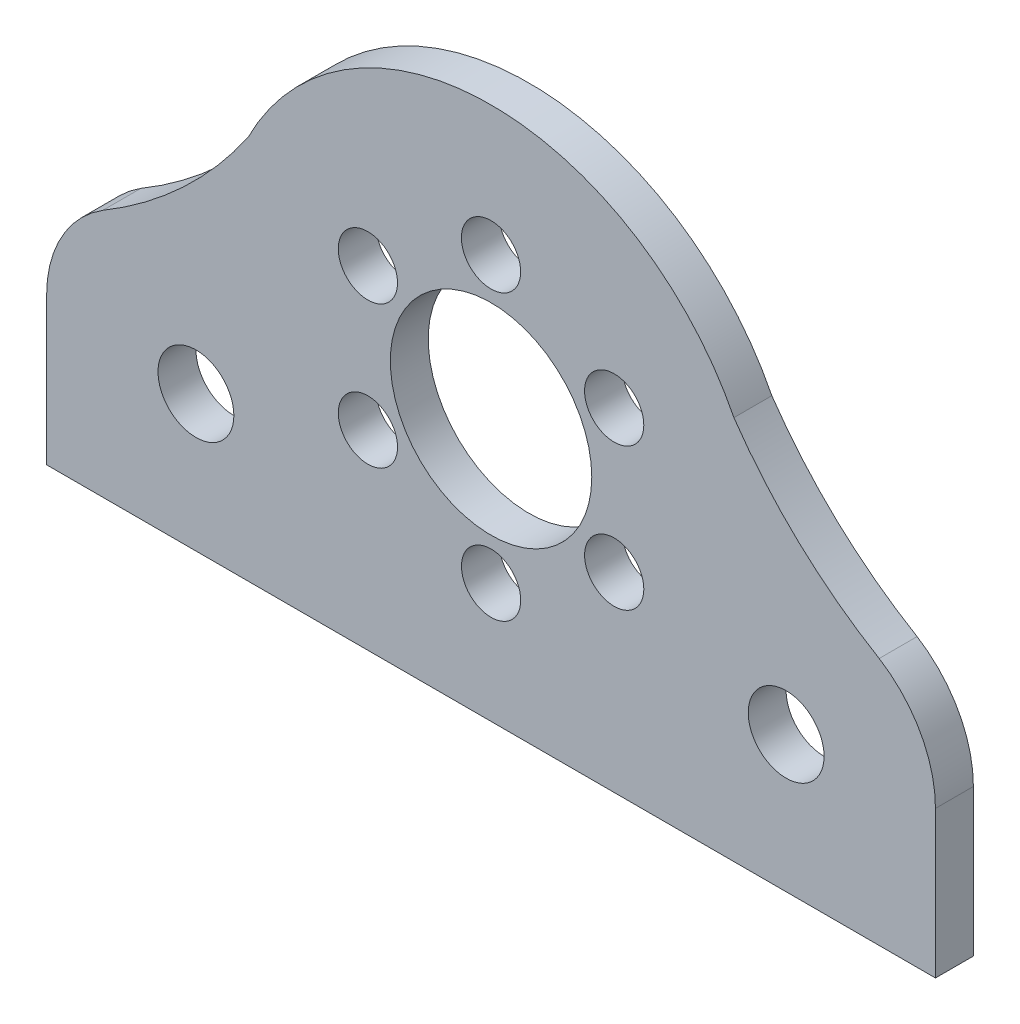
ISO-10303-21;
HEADER;
FILE_DESCRIPTION(('STEP AP214'),'2;1');
FILE_NAME('part.step','',(''),(''),'','','');
FILE_SCHEMA(('AUTOMOTIVE_DESIGN { 1 0 10303 214 1 1 1 1 }'));
ENDSEC;
DATA;
#1=APPLICATION_CONTEXT('core data for automotive mechanical design processes');
#2=APPLICATION_PROTOCOL_DEFINITION('international standard','automotive_design',2000,#1);
#3=PRODUCT_CONTEXT('',#1,'mechanical');
#4=PRODUCT('Part','Part','',(#3));
#5=PRODUCT_RELATED_PRODUCT_CATEGORY('part','',(#4));
#6=PRODUCT_DEFINITION_FORMATION('','',#4);
#7=PRODUCT_DEFINITION_CONTEXT('part definition',#1,'design');
#8=PRODUCT_DEFINITION('design','',#6,#7);
#9=PRODUCT_DEFINITION_SHAPE('','',#8);
#10=(LENGTH_UNIT() NAMED_UNIT(*) SI_UNIT(.MILLI.,.METRE.));
#11=(NAMED_UNIT(*) PLANE_ANGLE_UNIT() SI_UNIT($,.RADIAN.));
#12=(NAMED_UNIT(*) SI_UNIT($,.STERADIAN.) SOLID_ANGLE_UNIT());
#13=UNCERTAINTY_MEASURE_WITH_UNIT(LENGTH_MEASURE(1.E-05),#10,'distance_accuracy_value','');
#14=(GEOMETRIC_REPRESENTATION_CONTEXT(3) GLOBAL_UNCERTAINTY_ASSIGNED_CONTEXT((#13)) GLOBAL_UNIT_ASSIGNED_CONTEXT((#10,
#11,#12)) REPRESENTATION_CONTEXT('',''));
#15=CARTESIAN_POINT('',(0.,0.,0.));
#16=DIRECTION('',(0.,0.,1.));
#17=DIRECTION('',(1.,0.,0.));
#18=AXIS2_PLACEMENT_3D('',#15,#16,#17);
#19=CARTESIAN_POINT('',(18.75,0.,1.6));
#20=DIRECTION('',(-1.,0.,0.));
#21=DIRECTION('',(0.,-1.,0.));
#22=AXIS2_PLACEMENT_3D('',#19,#20,#21);
#23=PLANE('',#22);
#24=DIRECTION('',(0.,1.,0.));
#25=VECTOR('',#24,1.);
#26=CARTESIAN_POINT('',(18.75,0.,0.));
#27=LINE('',#26,#25);
#28=CARTESIAN_POINT('',(18.75,-11.05,0.));
#29=VERTEX_POINT('',#28);
#30=CARTESIAN_POINT('',(18.75,-4.85274711281599,0.));
#31=VERTEX_POINT('',#30);
#32=EDGE_CURVE('E177',#29,#31,#27,.T.);
#33=ORIENTED_EDGE('',*,*,#32,.T.);
#34=DIRECTION('',(0.,0.,-1.));
#35=VECTOR('',#34,1.);
#36=CARTESIAN_POINT('',(18.75,-4.85274711281599,1.6));
#37=LINE('',#36,#35);
#38=CARTESIAN_POINT('',(18.75,-4.85274711281599,1.6));
#39=VERTEX_POINT('',#38);
#40=EDGE_CURVE('E11',#39,#31,#37,.T.);
#41=ORIENTED_EDGE('',*,*,#40,.F.);
#42=DIRECTION('',(0.,1.,0.));
#43=VECTOR('',#42,1.);
#44=CARTESIAN_POINT('',(18.75,0.,1.6));
#45=LINE('',#44,#43);
#46=CARTESIAN_POINT('',(18.75,-11.05,1.6));
#47=VERTEX_POINT('',#46);
#48=EDGE_CURVE('E241',#47,#39,#45,.T.);
#49=ORIENTED_EDGE('',*,*,#48,.F.);
#50=DIRECTION('',(0.,0.,-1.));
#51=VECTOR('',#50,1.);
#52=CARTESIAN_POINT('',(18.75,-11.05,1.6));
#53=LINE('',#52,#51);
#54=EDGE_CURVE('E137',#47,#29,#53,.T.);
#55=ORIENTED_EDGE('',*,*,#54,.T.);
#56=EDGE_LOOP('',(#33,#41,#49,#55));
#57=FACE_BOUND('',#56,.T.);
#58=ADVANCED_FACE('F41',(#57),#23,.F.);
#59=CARTESIAN_POINT('',(13.686827991806,-4.85274711281598,1.6));
#60=DIRECTION('',(0.,0.,-1.));
#61=DIRECTION('',(-1.,0.,0.));
#62=AXIS2_PLACEMENT_3D('',#59,#60,#61);
#63=CYLINDRICAL_SURFACE('',#62,5.06317200819395);
#64=CARTESIAN_POINT('',(13.686827991806,-4.85274711281598,0.));
#65=DIRECTION('',(0.,0.,1.));
#66=DIRECTION('',(1.,0.,0.));
#67=AXIS2_PLACEMENT_3D('',#64,#65,#66);
#68=CIRCLE('',#67,5.06317200819395);
#69=CARTESIAN_POINT('',(16.3755062932759,-0.562441788510514,0.));
#70=VERTEX_POINT('',#69);
#71=EDGE_CURVE('E181',#31,#70,#68,.T.);
#72=ORIENTED_EDGE('',*,*,#71,.T.);
#73=DIRECTION('',(0.,0.,-1.));
#74=VECTOR('',#73,1.);
#75=CARTESIAN_POINT('',(16.3755062932759,-0.562441788510514,1.6));
#76=LINE('',#75,#74);
#77=CARTESIAN_POINT('',(16.3755062932759,-0.562441788510514,1.6));
#78=VERTEX_POINT('',#77);
#79=EDGE_CURVE('E51',#78,#70,#76,.T.);
#80=ORIENTED_EDGE('',*,*,#79,.F.);
#81=CARTESIAN_POINT('',(13.686827991806,-4.85274711281598,1.6));
#82=DIRECTION('',(0.,0.,1.));
#83=DIRECTION('',(1.,0.,0.));
#84=AXIS2_PLACEMENT_3D('',#81,#82,#83);
#85=CIRCLE('',#84,5.06317200819395);
#86=EDGE_CURVE('E98',#39,#78,#85,.T.);
#87=ORIENTED_EDGE('',*,*,#86,.F.);
#88=ORIENTED_EDGE('',*,*,#40,.T.);
#89=EDGE_LOOP('',(#72,#80,#87,#88));
#90=FACE_BOUND('',#89,.T.);
#91=ADVANCED_FACE('F322',(#90),#63,.T.);
#92=CARTESIAN_POINT('',(26.2731058799836,16.1553214426772,1.6));
#93=DIRECTION('',(0.,0.,-1.));
#94=DIRECTION('',(-1.,0.,0.));
#95=AXIS2_PLACEMENT_3D('',#92,#93,#94);
#96=CYLINDRICAL_SURFACE('',#95,19.4279717169047);
#97=CARTESIAN_POINT('',(26.2731058799836,16.1553214426772,0.));
#98=DIRECTION('',(0.,0.,1.));
#99=DIRECTION('',(1.,0.,0.));
#100=AXIS2_PLACEMENT_3D('',#97,#98,#99);
#101=CIRCLE('',#100,19.4279717169047);
#102=CARTESIAN_POINT('',(10.2472642255804,5.17267675658977,0.));
#103=VERTEX_POINT('',#102);
#104=EDGE_CURVE('E184',#70,#103,#101,.F.);
#105=ORIENTED_EDGE('',*,*,#104,.T.);
#106=DIRECTION('',(0.,0.,-1.));
#107=VECTOR('',#106,1.);
#108=CARTESIAN_POINT('',(10.2472642255804,5.17267675658977,1.6));
#109=LINE('',#108,#107);
#110=CARTESIAN_POINT('',(10.2472642255804,5.17267675658977,1.6));
#111=VERTEX_POINT('',#110);
#112=EDGE_CURVE('E212',#111,#103,#109,.T.);
#113=ORIENTED_EDGE('',*,*,#112,.F.);
#114=CARTESIAN_POINT('',(26.2731058799836,16.1553214426772,1.6));
#115=DIRECTION('',(0.,0.,1.));
#116=DIRECTION('',(1.,0.,0.));
#117=AXIS2_PLACEMENT_3D('',#114,#115,#116);
#118=CIRCLE('',#117,19.4279717169047);
#119=EDGE_CURVE('E222',#78,#111,#118,.F.);
#120=ORIENTED_EDGE('',*,*,#119,.F.);
#121=ORIENTED_EDGE('',*,*,#79,.T.);
#122=EDGE_LOOP('',(#105,#113,#120,#121));
#123=FACE_BOUND('',#122,.T.);
#124=ADVANCED_FACE('F220',(#123),#96,.F.);
#125=CARTESIAN_POINT('',(0.,0.,1.6));
#126=DIRECTION('',(0.,0.,-1.));
#127=DIRECTION('',(-1.,0.,0.));
#128=AXIS2_PLACEMENT_3D('',#125,#126,#127);
#129=CYLINDRICAL_SURFACE('',#128,11.4788069474586);
#130=CARTESIAN_POINT('',(0.,0.,0.));
#131=DIRECTION('',(0.,0.,1.));
#132=DIRECTION('',(1.,0.,0.));
#133=AXIS2_PLACEMENT_3D('',#130,#131,#132);
#134=CIRCLE('',#133,11.4788069474586);
#135=CARTESIAN_POINT('',(-10.2472642255804,5.17267675658977,0.));
#136=VERTEX_POINT('',#135);
#137=EDGE_CURVE('E187',#103,#136,#134,.T.);
#138=ORIENTED_EDGE('',*,*,#137,.T.);
#139=DIRECTION('',(0.,0.,-1.));
#140=VECTOR('',#139,1.);
#141=CARTESIAN_POINT('',(-10.2472642255804,5.17267675658977,1.6));
#142=LINE('',#141,#140);
#143=CARTESIAN_POINT('',(-10.2472642255804,5.17267675658977,1.6));
#144=VERTEX_POINT('',#143);
#145=EDGE_CURVE('E209',#144,#136,#142,.T.);
#146=ORIENTED_EDGE('',*,*,#145,.F.);
#147=CARTESIAN_POINT('',(0.,0.,1.6));
#148=DIRECTION('',(0.,0.,1.));
#149=DIRECTION('',(1.,0.,0.));
#150=AXIS2_PLACEMENT_3D('',#147,#148,#149);
#151=CIRCLE('',#150,11.4788069474586);
#152=EDGE_CURVE('E232',#111,#144,#151,.T.);
#153=ORIENTED_EDGE('',*,*,#152,.F.);
#154=ORIENTED_EDGE('',*,*,#112,.T.);
#155=EDGE_LOOP('',(#138,#146,#153,#154));
#156=FACE_BOUND('',#155,.T.);
#157=ADVANCED_FACE('F230',(#156),#129,.T.);
#158=CARTESIAN_POINT('',(-26.2731058799836,16.1553214426772,1.6));
#159=DIRECTION('',(0.,0.,-1.));
#160=DIRECTION('',(-1.,0.,0.));
#161=AXIS2_PLACEMENT_3D('',#158,#159,#160);
#162=CYLINDRICAL_SURFACE('',#161,19.4279717169047);
#163=CARTESIAN_POINT('',(-26.2731058799836,16.1553214426772,0.));
#164=DIRECTION('',(0.,0.,1.));
#165=DIRECTION('',(1.,0.,0.));
#166=AXIS2_PLACEMENT_3D('',#163,#164,#165);
#167=CIRCLE('',#166,19.4279717169047);
#168=CARTESIAN_POINT('',(-16.3755062932759,-0.562441788510506,0.));
#169=VERTEX_POINT('',#168);
#170=EDGE_CURVE('E191',#169,#136,#167,.T.);
#171=ORIENTED_EDGE('',*,*,#170,.F.);
#172=DIRECTION('',(0.,0.,-1.));
#173=VECTOR('',#172,1.);
#174=CARTESIAN_POINT('',(-16.3755062932759,-0.562441788510506,1.6));
#175=LINE('',#174,#173);
#176=CARTESIAN_POINT('',(-16.3755062932759,-0.562441788510506,1.6));
#177=VERTEX_POINT('',#176);
#178=EDGE_CURVE('E124',#177,#169,#175,.T.);
#179=ORIENTED_EDGE('',*,*,#178,.F.);
#180=CARTESIAN_POINT('',(-26.2731058799836,16.1553214426772,1.6));
#181=DIRECTION('',(0.,0.,1.));
#182=DIRECTION('',(1.,0.,0.));
#183=AXIS2_PLACEMENT_3D('',#180,#181,#182);
#184=CIRCLE('',#183,19.4279717169047);
#185=EDGE_CURVE('E130',#177,#144,#184,.T.);
#186=ORIENTED_EDGE('',*,*,#185,.T.);
#187=ORIENTED_EDGE('',*,*,#145,.T.);
#188=EDGE_LOOP('',(#171,#179,#186,#187));
#189=FACE_BOUND('',#188,.T.);
#190=ADVANCED_FACE('F333',(#189),#162,.F.);
#191=CARTESIAN_POINT('',(-13.686827991806,-4.85274711281598,1.6));
#192=DIRECTION('',(0.,0.,-1.));
#193=DIRECTION('',(-1.,0.,0.));
#194=AXIS2_PLACEMENT_3D('',#191,#192,#193);
#195=CYLINDRICAL_SURFACE('',#194,5.06317200819395);
#196=CARTESIAN_POINT('',(-13.686827991806,-4.85274711281598,0.));
#197=DIRECTION('',(0.,0.,1.));
#198=DIRECTION('',(1.,0.,0.));
#199=AXIS2_PLACEMENT_3D('',#196,#197,#198);
#200=CIRCLE('',#199,5.06317200819395);
#201=CARTESIAN_POINT('',(-18.75,-4.85274711281598,0.));
#202=VERTEX_POINT('',#201);
#203=EDGE_CURVE('E118',#202,#169,#200,.F.);
#204=ORIENTED_EDGE('',*,*,#203,.F.);
#205=DIRECTION('',(0.,0.,-1.));
#206=VECTOR('',#205,1.);
#207=CARTESIAN_POINT('',(-18.75,-4.85274711281598,1.6));
#208=LINE('',#207,#206);
#209=CARTESIAN_POINT('',(-18.75,-4.85274711281598,1.6));
#210=VERTEX_POINT('',#209);
#211=EDGE_CURVE('E113',#210,#202,#208,.T.);
#212=ORIENTED_EDGE('',*,*,#211,.F.);
#213=CARTESIAN_POINT('',(-13.686827991806,-4.85274711281598,1.6));
#214=DIRECTION('',(0.,0.,1.));
#215=DIRECTION('',(1.,0.,0.));
#216=AXIS2_PLACEMENT_3D('',#213,#214,#215);
#217=CIRCLE('',#216,5.06317200819395);
#218=EDGE_CURVE('E116',#210,#177,#217,.F.);
#219=ORIENTED_EDGE('',*,*,#218,.T.);
#220=ORIENTED_EDGE('',*,*,#178,.T.);
#221=EDGE_LOOP('',(#204,#212,#219,#220));
#222=FACE_BOUND('',#221,.T.);
#223=ADVANCED_FACE('F115',(#222),#195,.T.);
#224=CARTESIAN_POINT('',(-18.75,0.,1.6));
#225=DIRECTION('',(-1.,0.,0.));
#226=DIRECTION('',(0.,-1.,0.));
#227=AXIS2_PLACEMENT_3D('',#224,#225,#226);
#228=PLANE('',#227);
#229=DIRECTION('',(0.,1.,0.));
#230=VECTOR('',#229,1.);
#231=CARTESIAN_POINT('',(-18.75,0.,0.));
#232=LINE('',#231,#230);
#233=CARTESIAN_POINT('',(-18.75,-11.05,0.));
#234=VERTEX_POINT('',#233);
#235=EDGE_CURVE('E197',#234,#202,#232,.T.);
#236=ORIENTED_EDGE('',*,*,#235,.F.);
#237=DIRECTION('',(0.,0.,-1.));
#238=VECTOR('',#237,1.);
#239=CARTESIAN_POINT('',(-18.75,-11.05,1.6));
#240=LINE('',#239,#238);
#241=CARTESIAN_POINT('',(-18.75,-11.05,1.6));
#242=VERTEX_POINT('',#241);
#243=EDGE_CURVE('E87',#242,#234,#240,.T.);
#244=ORIENTED_EDGE('',*,*,#243,.F.);
#245=DIRECTION('',(0.,1.,0.));
#246=VECTOR('',#245,1.);
#247=CARTESIAN_POINT('',(-18.75,0.,1.6));
#248=LINE('',#247,#246);
#249=EDGE_CURVE('E128',#242,#210,#248,.T.);
#250=ORIENTED_EDGE('',*,*,#249,.T.);
#251=ORIENTED_EDGE('',*,*,#211,.T.);
#252=EDGE_LOOP('',(#236,#244,#250,#251));
#253=FACE_BOUND('',#252,.T.);
#254=ADVANCED_FACE('F133',(#253),#228,.T.);
#255=CARTESIAN_POINT('',(0.,0.,1.6));
#256=DIRECTION('',(0.,0.,-1.));
#257=DIRECTION('',(-1.,0.,0.));
#258=AXIS2_PLACEMENT_3D('',#255,#256,#257);
#259=CYLINDRICAL_SURFACE('',#258,4.25);
#260=CARTESIAN_POINT('',(0.,0.,1.6));
#261=DIRECTION('',(0.,0.,1.));
#262=DIRECTION('',(1.,0.,0.));
#263=AXIS2_PLACEMENT_3D('',#260,#261,#262);
#264=CIRCLE('',#263,4.25);
#265=CARTESIAN_POINT('',(4.25,0.,1.6));
#266=VERTEX_POINT('',#265);
#267=EDGE_CURVE('E244',#266,#266,#264,.T.);
#268=ORIENTED_EDGE('',*,*,#267,.T.);
#269=EDGE_LOOP('',(#268));
#270=FACE_BOUND('',#269,.T.);
#271=CARTESIAN_POINT('',(0.,0.,0.));
#272=DIRECTION('',(0.,0.,1.));
#273=DIRECTION('',(1.,0.,0.));
#274=AXIS2_PLACEMENT_3D('',#271,#272,#273);
#275=CIRCLE('',#274,4.25);
#276=CARTESIAN_POINT('',(4.25,0.,0.));
#277=VERTEX_POINT('',#276);
#278=EDGE_CURVE('E173',#277,#277,#275,.T.);
#279=ORIENTED_EDGE('',*,*,#278,.F.);
#280=EDGE_LOOP('',(#279));
#281=FACE_BOUND('',#280,.T.);
#282=ADVANCED_FACE('F307',(#270,#281),#259,.F.);
#283=CARTESIAN_POINT('',(-0.00119999997012094,5.99880001037141,1.6));
#284=DIRECTION('',(0.,0.,-1.));
#285=DIRECTION('',(-1.,0.,0.));
#286=AXIS2_PLACEMENT_3D('',#283,#284,#285);
#287=CYLINDRICAL_SURFACE('',#286,1.24999999706816);
#288=CARTESIAN_POINT('',(-0.00119999997012094,5.99880001037141,1.6));
#289=DIRECTION('',(0.,0.,1.));
#290=DIRECTION('',(1.,0.,0.));
#291=AXIS2_PLACEMENT_3D('',#288,#289,#290);
#292=CIRCLE('',#291,1.24999999706816);
#293=CARTESIAN_POINT('',(1.24879999709804,5.99880001037141,1.6));
#294=VERTEX_POINT('',#293);
#295=EDGE_CURVE('E248',#294,#294,#292,.T.);
#296=ORIENTED_EDGE('',*,*,#295,.T.);
#297=EDGE_LOOP('',(#296));
#298=FACE_BOUND('',#297,.T.);
#299=CARTESIAN_POINT('',(-0.00119999997012094,5.99880001037141,0.));
#300=DIRECTION('',(0.,0.,1.));
#301=DIRECTION('',(1.,0.,0.));
#302=AXIS2_PLACEMENT_3D('',#299,#300,#301);
#303=CIRCLE('',#302,1.24999999706816);
#304=CARTESIAN_POINT('',(1.24879999709804,5.99880001037141,0.));
#305=VERTEX_POINT('',#304);
#306=EDGE_CURVE('E169',#305,#305,#303,.T.);
#307=ORIENTED_EDGE('',*,*,#306,.F.);
#308=EDGE_LOOP('',(#307));
#309=FACE_BOUND('',#308,.T.);
#310=ADVANCED_FACE('F309',(#298,#309),#287,.F.);
#311=CARTESIAN_POINT('',(5.1945131922217,3.00043923092804,1.6));
#312=DIRECTION('',(0.,0.,-1.));
#313=DIRECTION('',(-1.,0.,0.));
#314=AXIS2_PLACEMENT_3D('',#311,#312,#313);
#315=CYLINDRICAL_SURFACE('',#314,1.25000000000009);
#316=CARTESIAN_POINT('',(5.1945131922217,3.00043923092804,1.6));
#317=DIRECTION('',(0.,0.,1.));
#318=DIRECTION('',(1.,0.,0.));
#319=AXIS2_PLACEMENT_3D('',#316,#317,#318);
#320=CIRCLE('',#319,1.25000000000009);
#321=CARTESIAN_POINT('',(6.44451319222179,3.00043923092804,1.6));
#322=VERTEX_POINT('',#321);
#323=EDGE_CURVE('E252',#322,#322,#320,.T.);
#324=ORIENTED_EDGE('',*,*,#323,.T.);
#325=EDGE_LOOP('',(#324));
#326=FACE_BOUND('',#325,.T.);
#327=CARTESIAN_POINT('',(5.1945131922217,3.00043923092804,0.));
#328=DIRECTION('',(0.,0.,1.));
#329=DIRECTION('',(1.,0.,0.));
#330=AXIS2_PLACEMENT_3D('',#327,#328,#329);
#331=CIRCLE('',#330,1.25000000000009);
#332=CARTESIAN_POINT('',(6.44451319222179,3.00043923092804,0.));
#333=VERTEX_POINT('',#332);
#334=EDGE_CURVE('E165',#333,#333,#331,.T.);
#335=ORIENTED_EDGE('',*,*,#334,.F.);
#336=EDGE_LOOP('',(#335));
#337=FACE_BOUND('',#336,.T.);
#338=ADVANCED_FACE('F316',(#326,#337),#315,.F.);
#339=CARTESIAN_POINT('',(5.19571319222205,-2.99836076907197,1.6));
#340=DIRECTION('',(0.,0.,-1.));
#341=DIRECTION('',(-1.,0.,0.));
#342=AXIS2_PLACEMENT_3D('',#339,#340,#341);
#343=CYLINDRICAL_SURFACE('',#342,1.25000000000043);
#344=CARTESIAN_POINT('',(5.19571319222205,-2.99836076907197,1.6));
#345=DIRECTION('',(0.,0.,1.));
#346=DIRECTION('',(1.,0.,0.));
#347=AXIS2_PLACEMENT_3D('',#344,#345,#346);
#348=CIRCLE('',#347,1.25000000000043);
#349=CARTESIAN_POINT('',(6.44571319222248,-2.99836076907197,1.6));
#350=VERTEX_POINT('',#349);
#351=EDGE_CURVE('E256',#350,#350,#348,.T.);
#352=ORIENTED_EDGE('',*,*,#351,.T.);
#353=EDGE_LOOP('',(#352));
#354=FACE_BOUND('',#353,.T.);
#355=CARTESIAN_POINT('',(5.19571319222205,-2.99836076907197,0.));
#356=DIRECTION('',(0.,0.,1.));
#357=DIRECTION('',(1.,0.,0.));
#358=AXIS2_PLACEMENT_3D('',#355,#356,#357);
#359=CIRCLE('',#358,1.25000000000043);
#360=CARTESIAN_POINT('',(6.44571319222248,-2.99836076907197,0.));
#361=VERTEX_POINT('',#360);
#362=EDGE_CURVE('E161',#361,#361,#359,.T.);
#363=ORIENTED_EDGE('',*,*,#362,.F.);
#364=EDGE_LOOP('',(#363));
#365=FACE_BOUND('',#364,.T.);
#366=ADVANCED_FACE('F397',(#354,#365),#343,.F.);
#367=CARTESIAN_POINT('',(0.00120000000012124,-5.99879999955681,1.6));
#368=DIRECTION('',(0.,0.,-1.));
#369=DIRECTION('',(-1.,0.,0.));
#370=AXIS2_PLACEMENT_3D('',#367,#368,#369);
#371=CYLINDRICAL_SURFACE('',#370,1.25000000000069);
#372=CARTESIAN_POINT('',(0.00120000000012124,-5.99879999955681,1.6));
#373=DIRECTION('',(0.,0.,1.));
#374=DIRECTION('',(1.,0.,0.));
#375=AXIS2_PLACEMENT_3D('',#372,#373,#374);
#376=CIRCLE('',#375,1.25000000000069);
#377=CARTESIAN_POINT('',(1.25120000000082,-5.99879999955681,1.6));
#378=VERTEX_POINT('',#377);
#379=EDGE_CURVE('E260',#378,#378,#376,.T.);
#380=ORIENTED_EDGE('',*,*,#379,.T.);
#381=EDGE_LOOP('',(#380));
#382=FACE_BOUND('',#381,.T.);
#383=CARTESIAN_POINT('',(0.00120000000012124,-5.99879999955681,0.));
#384=DIRECTION('',(0.,0.,1.));
#385=DIRECTION('',(1.,0.,0.));
#386=AXIS2_PLACEMENT_3D('',#383,#384,#385);
#387=CIRCLE('',#386,1.25000000000069);
#388=CARTESIAN_POINT('',(1.25120000000082,-5.99879999955681,0.));
#389=VERTEX_POINT('',#388);
#390=EDGE_CURVE('E157',#389,#389,#387,.T.);
#391=ORIENTED_EDGE('',*,*,#390,.F.);
#392=EDGE_LOOP('',(#391));
#393=FACE_BOUND('',#392,.T.);
#394=ADVANCED_FACE('F388',(#382,#393),#371,.F.);
#395=CARTESIAN_POINT('',(-5.19451319222214,-3.00043923004164,1.6));
#396=DIRECTION('',(0.,0.,-1.));
#397=DIRECTION('',(-1.,0.,0.));
#398=AXIS2_PLACEMENT_3D('',#395,#396,#397);
#399=CYLINDRICAL_SURFACE('',#398,1.25000000000063);
#400=CARTESIAN_POINT('',(-5.19451319222214,-3.00043923004164,1.6));
#401=DIRECTION('',(0.,0.,1.));
#402=DIRECTION('',(1.,0.,0.));
#403=AXIS2_PLACEMENT_3D('',#400,#401,#402);
#404=CIRCLE('',#403,1.25000000000063);
#405=CARTESIAN_POINT('',(-3.94451319222151,-3.00043923004164,1.6));
#406=VERTEX_POINT('',#405);
#407=EDGE_CURVE('E264',#406,#406,#404,.T.);
#408=ORIENTED_EDGE('',*,*,#407,.T.);
#409=EDGE_LOOP('',(#408));
#410=FACE_BOUND('',#409,.T.);
#411=CARTESIAN_POINT('',(-5.19451319222214,-3.00043923004164,0.));
#412=DIRECTION('',(0.,0.,1.));
#413=DIRECTION('',(1.,0.,0.));
#414=AXIS2_PLACEMENT_3D('',#411,#412,#413);
#415=CIRCLE('',#414,1.25000000000063);
#416=CARTESIAN_POINT('',(-3.94451319222151,-3.00043923004164,0.));
#417=VERTEX_POINT('',#416);
#418=EDGE_CURVE('E153',#417,#417,#415,.T.);
#419=ORIENTED_EDGE('',*,*,#418,.F.);
#420=EDGE_LOOP('',(#419));
#421=FACE_BOUND('',#420,.T.);
#422=ADVANCED_FACE('F379',(#410,#421),#399,.F.);
#423=CARTESIAN_POINT('',(-5.19571324784459,2.99836080206472,1.6));
#424=DIRECTION('',(0.,0.,-1.));
#425=DIRECTION('',(-1.,0.,0.));
#426=AXIS2_PLACEMENT_3D('',#423,#424,#425);
#427=CYLINDRICAL_SURFACE('',#426,1.25000000660969);
#428=CARTESIAN_POINT('',(-5.19571324784459,2.99836080206472,1.6));
#429=DIRECTION('',(0.,0.,1.));
#430=DIRECTION('',(1.,0.,0.));
#431=AXIS2_PLACEMENT_3D('',#428,#429,#430);
#432=CIRCLE('',#431,1.25000000660969);
#433=CARTESIAN_POINT('',(-3.9457132412349,2.99836080206472,1.6));
#434=VERTEX_POINT('',#433);
#435=EDGE_CURVE('E268',#434,#434,#432,.T.);
#436=ORIENTED_EDGE('',*,*,#435,.T.);
#437=EDGE_LOOP('',(#436));
#438=FACE_BOUND('',#437,.T.);
#439=CARTESIAN_POINT('',(-5.19571324784459,2.99836080206472,0.));
#440=DIRECTION('',(0.,0.,1.));
#441=DIRECTION('',(1.,0.,0.));
#442=AXIS2_PLACEMENT_3D('',#439,#440,#441);
#443=CIRCLE('',#442,1.25000000660969);
#444=CARTESIAN_POINT('',(-3.9457132412349,2.99836080206472,0.));
#445=VERTEX_POINT('',#444);
#446=EDGE_CURVE('E149',#445,#445,#443,.T.);
#447=ORIENTED_EDGE('',*,*,#446,.F.);
#448=EDGE_LOOP('',(#447));
#449=FACE_BOUND('',#448,.T.);
#450=ADVANCED_FACE('F371',(#438,#449),#427,.F.);
#451=CARTESIAN_POINT('',(12.45,-5.3,1.6));
#452=DIRECTION('',(0.,0.,-1.));
#453=DIRECTION('',(-1.,0.,0.));
#454=AXIS2_PLACEMENT_3D('',#451,#452,#453);
#455=CYLINDRICAL_SURFACE('',#454,1.6);
#456=CARTESIAN_POINT('',(12.45,-5.3,1.6));
#457=DIRECTION('',(0.,0.,1.));
#458=DIRECTION('',(1.,0.,0.));
#459=AXIS2_PLACEMENT_3D('',#456,#457,#458);
#460=CIRCLE('',#459,1.6);
#461=CARTESIAN_POINT('',(14.05,-5.3,1.6));
#462=VERTEX_POINT('',#461);
#463=EDGE_CURVE('E272',#462,#462,#460,.T.);
#464=ORIENTED_EDGE('',*,*,#463,.T.);
#465=EDGE_LOOP('',(#464));
#466=FACE_BOUND('',#465,.T.);
#467=CARTESIAN_POINT('',(12.45,-5.3,0.));
#468=DIRECTION('',(0.,0.,1.));
#469=DIRECTION('',(1.,0.,0.));
#470=AXIS2_PLACEMENT_3D('',#467,#468,#469);
#471=CIRCLE('',#470,1.6);
#472=CARTESIAN_POINT('',(14.05,-5.3,0.));
#473=VERTEX_POINT('',#472);
#474=EDGE_CURVE('E145',#473,#473,#471,.T.);
#475=ORIENTED_EDGE('',*,*,#474,.F.);
#476=EDGE_LOOP('',(#475));
#477=FACE_BOUND('',#476,.T.);
#478=ADVANCED_FACE('F285',(#466,#477),#455,.F.);
#479=CARTESIAN_POINT('',(-12.45,-5.3,1.6));
#480=DIRECTION('',(0.,0.,-1.));
#481=DIRECTION('',(-1.,0.,0.));
#482=AXIS2_PLACEMENT_3D('',#479,#480,#481);
#483=CYLINDRICAL_SURFACE('',#482,1.6);
#484=CARTESIAN_POINT('',(-12.45,-5.3,1.6));
#485=DIRECTION('',(0.,0.,1.));
#486=DIRECTION('',(1.,0.,0.));
#487=AXIS2_PLACEMENT_3D('',#484,#485,#486);
#488=CIRCLE('',#487,1.6);
#489=CARTESIAN_POINT('',(-10.85,-5.3,1.6));
#490=VERTEX_POINT('',#489);
#491=EDGE_CURVE('E202',#490,#490,#488,.F.);
#492=ORIENTED_EDGE('',*,*,#491,.F.);
#493=EDGE_LOOP('',(#492));
#494=FACE_BOUND('',#493,.T.);
#495=CARTESIAN_POINT('',(-12.45,-5.3,0.));
#496=DIRECTION('',(0.,0.,1.));
#497=DIRECTION('',(1.,0.,0.));
#498=AXIS2_PLACEMENT_3D('',#495,#496,#497);
#499=CIRCLE('',#498,1.6);
#500=CARTESIAN_POINT('',(-10.85,-5.3,0.));
#501=VERTEX_POINT('',#500);
#502=EDGE_CURVE('E141',#501,#501,#499,.F.);
#503=ORIENTED_EDGE('',*,*,#502,.T.);
#504=EDGE_LOOP('',(#503));
#505=FACE_BOUND('',#504,.T.);
#506=ADVANCED_FACE('F43',(#494,#505),#483,.F.);
#507=CARTESIAN_POINT('',(0.,-11.05,1.6));
#508=DIRECTION('',(0.,1.,0.));
#509=DIRECTION('',(0.,0.,1.));
#510=AXIS2_PLACEMENT_3D('',#507,#508,#509);
#511=PLANE('',#510);
#512=DIRECTION('',(1.,0.,0.));
#513=VECTOR('',#512,1.);
#514=CARTESIAN_POINT('',(0.,-11.05,0.));
#515=LINE('',#514,#513);
#516=EDGE_CURVE('E90',#234,#29,#515,.T.);
#517=ORIENTED_EDGE('',*,*,#516,.T.);
#518=ORIENTED_EDGE('',*,*,#54,.F.);
#519=DIRECTION('',(1.,0.,0.));
#520=VECTOR('',#519,1.);
#521=CARTESIAN_POINT('',(0.,-11.05,1.6));
#522=LINE('',#521,#520);
#523=EDGE_CURVE('E59',#242,#47,#522,.T.);
#524=ORIENTED_EDGE('',*,*,#523,.F.);
#525=ORIENTED_EDGE('',*,*,#243,.T.);
#526=EDGE_LOOP('',(#517,#518,#524,#525));
#527=FACE_BOUND('',#526,.T.);
#528=ADVANCED_FACE('F284',(#527),#511,.F.);
#529=CARTESIAN_POINT('',(0.,0.,1.6));
#530=DIRECTION('',(0.,0.,1.));
#531=DIRECTION('',(1.,0.,0.));
#532=AXIS2_PLACEMENT_3D('',#529,#530,#531);
#533=PLANE('',#532);
#534=ORIENTED_EDGE('',*,*,#491,.T.);
#535=EDGE_LOOP('',(#534));
#536=FACE_BOUND('',#535,.T.);
#537=ORIENTED_EDGE('',*,*,#463,.F.);
#538=EDGE_LOOP('',(#537));
#539=FACE_BOUND('',#538,.T.);
#540=ORIENTED_EDGE('',*,*,#435,.F.);
#541=EDGE_LOOP('',(#540));
#542=FACE_BOUND('',#541,.T.);
#543=ORIENTED_EDGE('',*,*,#407,.F.);
#544=EDGE_LOOP('',(#543));
#545=FACE_BOUND('',#544,.T.);
#546=ORIENTED_EDGE('',*,*,#379,.F.);
#547=EDGE_LOOP('',(#546));
#548=FACE_BOUND('',#547,.T.);
#549=ORIENTED_EDGE('',*,*,#351,.F.);
#550=EDGE_LOOP('',(#549));
#551=FACE_BOUND('',#550,.T.);
#552=ORIENTED_EDGE('',*,*,#323,.F.);
#553=EDGE_LOOP('',(#552));
#554=FACE_BOUND('',#553,.T.);
#555=ORIENTED_EDGE('',*,*,#295,.F.);
#556=EDGE_LOOP('',(#555));
#557=FACE_BOUND('',#556,.T.);
#558=ORIENTED_EDGE('',*,*,#267,.F.);
#559=EDGE_LOOP('',(#558));
#560=FACE_BOUND('',#559,.T.);
#561=ORIENTED_EDGE('',*,*,#48,.T.);
#562=ORIENTED_EDGE('',*,*,#86,.T.);
#563=ORIENTED_EDGE('',*,*,#119,.T.);
#564=ORIENTED_EDGE('',*,*,#152,.T.);
#565=ORIENTED_EDGE('',*,*,#185,.F.);
#566=ORIENTED_EDGE('',*,*,#218,.F.);
#567=ORIENTED_EDGE('',*,*,#249,.F.);
#568=ORIENTED_EDGE('',*,*,#523,.T.);
#569=EDGE_LOOP('',(#561,#562,#563,#564,#565,#566,#567,#568));
#570=FACE_BOUND('',#569,.T.);
#571=ADVANCED_FACE('F127',(#536,#539,#542,#545,#548,#551,#554,#557,#560,#570),#533,.T.);
#572=CARTESIAN_POINT('',(0.,0.,0.));
#573=DIRECTION('',(0.,0.,1.));
#574=DIRECTION('',(1.,0.,0.));
#575=AXIS2_PLACEMENT_3D('',#572,#573,#574);
#576=PLANE('',#575);
#577=ORIENTED_EDGE('',*,*,#502,.F.);
#578=EDGE_LOOP('',(#577));
#579=FACE_BOUND('',#578,.T.);
#580=ORIENTED_EDGE('',*,*,#474,.T.);
#581=EDGE_LOOP('',(#580));
#582=FACE_BOUND('',#581,.T.);
#583=ORIENTED_EDGE('',*,*,#446,.T.);
#584=EDGE_LOOP('',(#583));
#585=FACE_BOUND('',#584,.T.);
#586=ORIENTED_EDGE('',*,*,#418,.T.);
#587=EDGE_LOOP('',(#586));
#588=FACE_BOUND('',#587,.T.);
#589=ORIENTED_EDGE('',*,*,#390,.T.);
#590=EDGE_LOOP('',(#589));
#591=FACE_BOUND('',#590,.T.);
#592=ORIENTED_EDGE('',*,*,#362,.T.);
#593=EDGE_LOOP('',(#592));
#594=FACE_BOUND('',#593,.T.);
#595=ORIENTED_EDGE('',*,*,#334,.T.);
#596=EDGE_LOOP('',(#595));
#597=FACE_BOUND('',#596,.T.);
#598=ORIENTED_EDGE('',*,*,#306,.T.);
#599=EDGE_LOOP('',(#598));
#600=FACE_BOUND('',#599,.T.);
#601=ORIENTED_EDGE('',*,*,#278,.T.);
#602=EDGE_LOOP('',(#601));
#603=FACE_BOUND('',#602,.T.);
#604=ORIENTED_EDGE('',*,*,#32,.F.);
#605=ORIENTED_EDGE('',*,*,#516,.F.);
#606=ORIENTED_EDGE('',*,*,#235,.T.);
#607=ORIENTED_EDGE('',*,*,#203,.T.);
#608=ORIENTED_EDGE('',*,*,#170,.T.);
#609=ORIENTED_EDGE('',*,*,#137,.F.);
#610=ORIENTED_EDGE('',*,*,#104,.F.);
#611=ORIENTED_EDGE('',*,*,#71,.F.);
#612=EDGE_LOOP('',(#604,#605,#606,#607,#608,#609,#610,#611));
#613=FACE_BOUND('',#612,.T.);
#614=ADVANCED_FACE('F226',(#579,#582,#585,#588,#591,#594,#597,#600,#603,#613),#576,.F.);
#615=CLOSED_SHELL('',(#58,#91,#124,#157,#190,#223,#254,#282,#310,#338,#366,#394,#422,#450,#478,
#506,#528,#571,#614));
#616=MANIFOLD_SOLID_BREP('B2',#615);
#617=ADVANCED_BREP_SHAPE_REPRESENTATION('',(#18,#616),#14);
#618=SHAPE_DEFINITION_REPRESENTATION(#9,#617);
ENDSEC;
END-ISO-10303-21;
